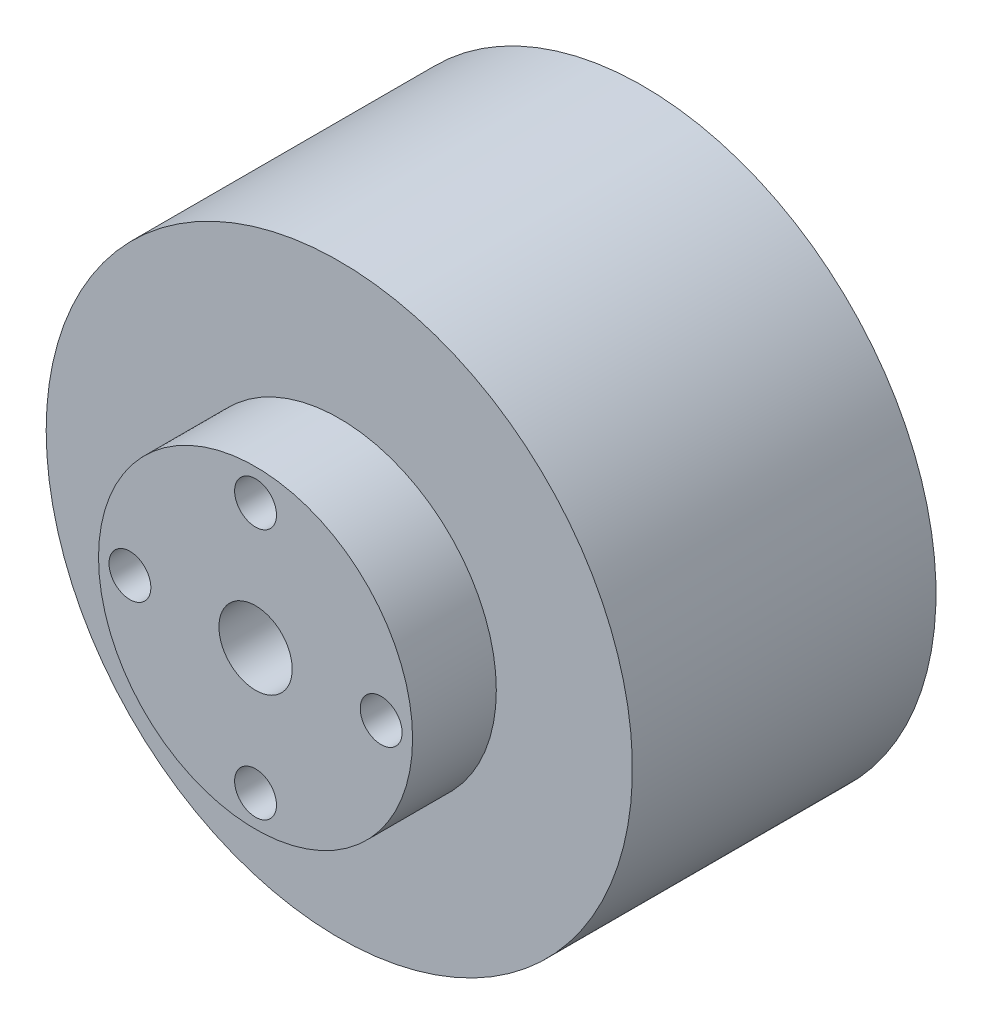
ISO-10303-21;
HEADER;
FILE_DESCRIPTION(('STEP AP214'),'2;1');
FILE_NAME('part.step','',(''),(''),'','','');
FILE_SCHEMA(('AUTOMOTIVE_DESIGN { 1 0 10303 214 1 1 1 1 }'));
ENDSEC;
DATA;
#1=APPLICATION_CONTEXT('core data for automotive mechanical design processes');
#2=APPLICATION_PROTOCOL_DEFINITION('international standard','automotive_design',2000,#1);
#3=PRODUCT_CONTEXT('',#1,'mechanical');
#4=PRODUCT('Part','Part','',(#3));
#5=PRODUCT_RELATED_PRODUCT_CATEGORY('part','',(#4));
#6=PRODUCT_DEFINITION_FORMATION('','',#4);
#7=PRODUCT_DEFINITION_CONTEXT('part definition',#1,'design');
#8=PRODUCT_DEFINITION('design','',#6,#7);
#9=PRODUCT_DEFINITION_SHAPE('','',#8);
#10=(LENGTH_UNIT() NAMED_UNIT(*) SI_UNIT(.MILLI.,.METRE.));
#11=(NAMED_UNIT(*) PLANE_ANGLE_UNIT() SI_UNIT($,.RADIAN.));
#12=(NAMED_UNIT(*) SI_UNIT($,.STERADIAN.) SOLID_ANGLE_UNIT());
#13=UNCERTAINTY_MEASURE_WITH_UNIT(LENGTH_MEASURE(1.E-05),#10,'distance_accuracy_value','');
#14=(GEOMETRIC_REPRESENTATION_CONTEXT(3) GLOBAL_UNCERTAINTY_ASSIGNED_CONTEXT((#13)) GLOBAL_UNIT_ASSIGNED_CONTEXT((#10,
#11,#12)) REPRESENTATION_CONTEXT('',''));
#15=CARTESIAN_POINT('',(0.,0.,0.));
#16=DIRECTION('',(0.,0.,1.));
#17=DIRECTION('',(1.,0.,0.));
#18=AXIS2_PLACEMENT_3D('',#15,#16,#17);
#19=CARTESIAN_POINT('',(0.,0.,14.5));
#20=DIRECTION('',(0.,0.,-1.));
#21=DIRECTION('',(-1.,0.,0.));
#22=AXIS2_PLACEMENT_3D('',#19,#20,#21);
#23=CYLINDRICAL_SURFACE('',#22,14.);
#24=CARTESIAN_POINT('',(0.,0.,14.5));
#25=DIRECTION('',(0.,0.,1.));
#26=DIRECTION('',(1.,0.,0.));
#27=AXIS2_PLACEMENT_3D('',#24,#25,#26);
#28=CIRCLE('',#27,14.);
#29=CARTESIAN_POINT('',(-14.,0.,14.5));
#30=VERTEX_POINT('',#29);
#31=EDGE_CURVE('E47',#30,#30,#28,.T.);
#32=CARTESIAN_POINT('',(0.,0.,0.));
#33=DIRECTION('',(0.,0.,1.));
#34=DIRECTION('',(1.,0.,0.));
#35=AXIS2_PLACEMENT_3D('',#32,#33,#34);
#36=CIRCLE('',#35,14.);
#37=CARTESIAN_POINT('',(-14.,0.,0.));
#38=VERTEX_POINT('',#37);
#39=EDGE_CURVE('E42',#38,#38,#36,.T.);
#40=CARTESIAN_POINT('',(-14.,0.,14.5));
#41=CARTESIAN_POINT('',(-14.,0.,14.3489583333333));
#42=CARTESIAN_POINT('',(-14.,0.,14.1979166666667));
#43=CARTESIAN_POINT('',(-14.,0.,13.8958333333333));
#44=CARTESIAN_POINT('',(-14.,0.,13.7447916666667));
#45=CARTESIAN_POINT('',(-14.,0.,13.4427083333333));
#46=CARTESIAN_POINT('',(-14.,0.,13.2916666666667));
#47=CARTESIAN_POINT('',(-14.,0.,12.9895833333333));
#48=CARTESIAN_POINT('',(-14.,0.,12.8385416666667));
#49=CARTESIAN_POINT('',(-14.,0.,12.5364583333333));
#50=CARTESIAN_POINT('',(-14.,0.,12.3854166666667));
#51=CARTESIAN_POINT('',(-14.,0.,12.0833333333333));
#52=CARTESIAN_POINT('',(-14.,0.,11.9322916666667));
#53=CARTESIAN_POINT('',(-14.,0.,11.6302083333333));
#54=CARTESIAN_POINT('',(-14.,0.,11.4791666666667));
#55=CARTESIAN_POINT('',(-14.,0.,11.1770833333333));
#56=CARTESIAN_POINT('',(-14.,0.,11.0260416666667));
#57=CARTESIAN_POINT('',(-14.,0.,10.7239583333333));
#58=CARTESIAN_POINT('',(-14.,0.,10.5729166666667));
#59=CARTESIAN_POINT('',(-14.,0.,10.2708333333333));
#60=CARTESIAN_POINT('',(-14.,0.,10.1197916666667));
#61=CARTESIAN_POINT('',(-14.,0.,9.81770833333333));
#62=CARTESIAN_POINT('',(-14.,0.,9.66666666666667));
#63=CARTESIAN_POINT('',(-14.,0.,9.36458333333333));
#64=CARTESIAN_POINT('',(-14.,0.,9.21354166666667));
#65=CARTESIAN_POINT('',(-14.,0.,8.91145833333333));
#66=CARTESIAN_POINT('',(-14.,0.,8.76041666666667));
#67=CARTESIAN_POINT('',(-14.,0.,8.45833333333333));
#68=CARTESIAN_POINT('',(-14.,0.,8.30729166666667));
#69=CARTESIAN_POINT('',(-14.,0.,8.00520833333333));
#70=CARTESIAN_POINT('',(-14.,0.,7.85416666666667));
#71=CARTESIAN_POINT('',(-14.,0.,7.55208333333333));
#72=CARTESIAN_POINT('',(-14.,0.,7.40104166666667));
#73=CARTESIAN_POINT('',(-14.,0.,7.09895833333333));
#74=CARTESIAN_POINT('',(-14.,0.,6.94791666666667));
#75=CARTESIAN_POINT('',(-14.,0.,6.64583333333333));
#76=CARTESIAN_POINT('',(-14.,0.,6.49479166666667));
#77=CARTESIAN_POINT('',(-14.,0.,6.19270833333333));
#78=CARTESIAN_POINT('',(-14.,0.,6.04166666666667));
#79=CARTESIAN_POINT('',(-14.,0.,5.73958333333333));
#80=CARTESIAN_POINT('',(-14.,0.,5.58854166666667));
#81=CARTESIAN_POINT('',(-14.,0.,5.28645833333333));
#82=CARTESIAN_POINT('',(-14.,0.,5.13541666666667));
#83=CARTESIAN_POINT('',(-14.,0.,4.83333333333333));
#84=CARTESIAN_POINT('',(-14.,0.,4.68229166666667));
#85=CARTESIAN_POINT('',(-14.,0.,4.38020833333333));
#86=CARTESIAN_POINT('',(-14.,0.,4.22916666666667));
#87=CARTESIAN_POINT('',(-14.,0.,3.92708333333333));
#88=CARTESIAN_POINT('',(-14.,0.,3.77604166666667));
#89=CARTESIAN_POINT('',(-14.,0.,3.47395833333333));
#90=CARTESIAN_POINT('',(-14.,0.,3.32291666666667));
#91=CARTESIAN_POINT('',(-14.,0.,3.02083333333333));
#92=CARTESIAN_POINT('',(-14.,0.,2.86979166666667));
#93=CARTESIAN_POINT('',(-14.,0.,2.56770833333333));
#94=CARTESIAN_POINT('',(-14.,0.,2.41666666666667));
#95=CARTESIAN_POINT('',(-14.,0.,2.11458333333333));
#96=CARTESIAN_POINT('',(-14.,0.,1.96354166666667));
#97=CARTESIAN_POINT('',(-14.,0.,1.66145833333333));
#98=CARTESIAN_POINT('',(-14.,0.,1.51041666666667));
#99=CARTESIAN_POINT('',(-14.,0.,1.20833333333333));
#100=CARTESIAN_POINT('',(-14.,0.,1.05729166666667));
#101=CARTESIAN_POINT('',(-14.,0.,0.755208333333334));
#102=CARTESIAN_POINT('',(-14.,0.,0.604166666666667));
#103=CARTESIAN_POINT('',(-14.,0.,0.302083333333333));
#104=CARTESIAN_POINT('',(-14.,0.,0.151041666666667));
#105=CARTESIAN_POINT('',(-14.,0.,0.));
#106=B_SPLINE_CURVE_WITH_KNOTS('',3,(#40,#41,#42,#43,#44,#45,#46,#47,#48,#49,#50,#51,#52,#53,
#54,#55,#56,#57,#58,#59,#60,#61,#62,#63,#64,#65,#66,#67,#68,#69,#70,#71,#72,#73,#74,#75,#76,#77,
#78,#79,#80,#81,#82,#83,#84,#85,#86,#87,#88,#89,#90,#91,#92,#93,#94,#95,#96,#97,#98,#99,#100,
#101,#102,#103,#104,#105),.UNSPECIFIED.,.F.,.F.,(4,2,2,2,2,2,2,2,2,2,2,2,2,2,2,2,2,2,2,2,2,2,2,
2,2,2,2,2,2,2,2,2,4),(0.,0.453125,0.906250000000001,1.359375,1.8125,2.265625,2.71875,3.171875,
3.625,4.078125,4.53125,4.984375,5.4375,5.890625,6.34375,6.796875,7.25,7.703125,8.15625,8.609375,
9.0625,9.515625,9.96875,10.421875,10.875,11.328125,11.78125,12.234375,12.6875,13.140625,
13.59375,14.046875,14.5),.UNSPECIFIED.);
#107=EDGE_CURVE('BSEAM39',#30,#38,#106,.T.);
#108=ORIENTED_EDGE('',*,*,#31,.F.);
#109=ORIENTED_EDGE('',*,*,#39,.T.);
#110=ORIENTED_EDGE('',*,*,#107,.T.);
#111=ORIENTED_EDGE('',*,*,#107,.F.);
#112=EDGE_LOOP('',(#108,#110,#109,#111));
#113=FACE_BOUND('',#112,.T.);
#114=ADVANCED_FACE('F39',(#113),#23,.T.);
#115=CARTESIAN_POINT('',(0.,0.,14.5));
#116=DIRECTION('',(0.,0.,1.));
#117=DIRECTION('',(1.,0.,0.));
#118=AXIS2_PLACEMENT_3D('',#115,#116,#117);
#119=PLANE('',#118);
#120=CARTESIAN_POINT('',(0.,0.,14.5));
#121=DIRECTION('',(0.,0.,1.));
#122=DIRECTION('',(1.,0.,0.));
#123=AXIS2_PLACEMENT_3D('',#120,#121,#122);
#124=CIRCLE('',#123,7.5);
#125=CARTESIAN_POINT('',(7.5,0.,14.5));
#126=VERTEX_POINT('',#125);
#127=EDGE_CURVE('E10',#126,#126,#124,.T.);
#128=ORIENTED_EDGE('',*,*,#127,.F.);
#129=EDGE_LOOP('',(#128));
#130=FACE_BOUND('',#129,.T.);
#131=ORIENTED_EDGE('',*,*,#31,.T.);
#132=EDGE_LOOP('',(#131));
#133=FACE_BOUND('',#132,.T.);
#134=ADVANCED_FACE('F143',(#130,#133),#119,.T.);
#135=CARTESIAN_POINT('',(0.,0.,0.));
#136=DIRECTION('',(0.,0.,1.));
#137=DIRECTION('',(1.,0.,0.));
#138=AXIS2_PLACEMENT_3D('',#135,#136,#137);
#139=PLANE('',#138);
#140=CARTESIAN_POINT('',(0.,8.,0.));
#141=DIRECTION('',(0.,0.,1.));
#142=DIRECTION('',(1.,0.,0.));
#143=AXIS2_PLACEMENT_3D('',#140,#141,#142);
#144=CIRCLE('',#143,1.5);
#145=CARTESIAN_POINT('',(1.5,8.,0.));
#146=VERTEX_POINT('',#145);
#147=EDGE_CURVE('E123',#146,#146,#144,.T.);
#148=ORIENTED_EDGE('',*,*,#147,.T.);
#149=EDGE_LOOP('',(#148));
#150=FACE_BOUND('',#149,.T.);
#151=CARTESIAN_POINT('',(-8.,0.,0.));
#152=DIRECTION('',(0.,0.,1.));
#153=DIRECTION('',(1.,0.,0.));
#154=AXIS2_PLACEMENT_3D('',#151,#152,#153);
#155=CIRCLE('',#154,1.5);
#156=CARTESIAN_POINT('',(-6.5,0.,0.));
#157=VERTEX_POINT('',#156);
#158=EDGE_CURVE('E115',#157,#157,#155,.T.);
#159=ORIENTED_EDGE('',*,*,#158,.T.);
#160=EDGE_LOOP('',(#159));
#161=FACE_BOUND('',#160,.T.);
#162=CARTESIAN_POINT('',(0.,-8.,0.));
#163=DIRECTION('',(0.,0.,1.));
#164=DIRECTION('',(1.,0.,0.));
#165=AXIS2_PLACEMENT_3D('',#162,#163,#164);
#166=CIRCLE('',#165,1.5);
#167=CARTESIAN_POINT('',(1.5,-8.,0.));
#168=VERTEX_POINT('',#167);
#169=EDGE_CURVE('E107',#168,#168,#166,.T.);
#170=ORIENTED_EDGE('',*,*,#169,.T.);
#171=EDGE_LOOP('',(#170));
#172=FACE_BOUND('',#171,.T.);
#173=CARTESIAN_POINT('',(8.,0.,0.));
#174=DIRECTION('',(0.,0.,1.));
#175=DIRECTION('',(1.,0.,0.));
#176=AXIS2_PLACEMENT_3D('',#173,#174,#175);
#177=CIRCLE('',#176,1.5);
#178=CARTESIAN_POINT('',(9.5,0.,0.));
#179=VERTEX_POINT('',#178);
#180=EDGE_CURVE('E99',#179,#179,#177,.T.);
#181=ORIENTED_EDGE('',*,*,#180,.T.);
#182=EDGE_LOOP('',(#181));
#183=FACE_BOUND('',#182,.T.);
#184=CARTESIAN_POINT('',(0.,0.,0.));
#185=DIRECTION('',(0.,0.,1.));
#186=DIRECTION('',(1.,0.,0.));
#187=AXIS2_PLACEMENT_3D('',#184,#185,#186);
#188=CIRCLE('',#187,1.75);
#189=CARTESIAN_POINT('',(1.75,0.,0.));
#190=VERTEX_POINT('',#189);
#191=EDGE_CURVE('E58',#190,#190,#188,.T.);
#192=ORIENTED_EDGE('',*,*,#191,.T.);
#193=EDGE_LOOP('',(#192));
#194=FACE_BOUND('',#193,.T.);
#195=ORIENTED_EDGE('',*,*,#39,.F.);
#196=EDGE_LOOP('',(#195));
#197=FACE_BOUND('',#196,.T.);
#198=ADVANCED_FACE('F148',(#150,#161,#172,#183,#194,#197),#139,.F.);
#199=CARTESIAN_POINT('',(0.,0.,18.5));
#200=DIRECTION('',(0.,0.,-1.));
#201=DIRECTION('',(-1.,0.,0.));
#202=AXIS2_PLACEMENT_3D('',#199,#200,#201);
#203=CYLINDRICAL_SURFACE('',#202,7.5);
#204=CARTESIAN_POINT('',(0.,0.,18.5));
#205=DIRECTION('',(0.,0.,1.));
#206=DIRECTION('',(1.,0.,0.));
#207=AXIS2_PLACEMENT_3D('',#204,#205,#206);
#208=CIRCLE('',#207,7.5);
#209=CARTESIAN_POINT('',(7.5,0.,18.5));
#210=VERTEX_POINT('',#209);
#211=EDGE_CURVE('E54',#210,#210,#208,.T.);
#212=ORIENTED_EDGE('',*,*,#211,.F.);
#213=EDGE_LOOP('',(#212));
#214=FACE_BOUND('',#213,.T.);
#215=ORIENTED_EDGE('',*,*,#127,.T.);
#216=EDGE_LOOP('',(#215));
#217=FACE_BOUND('',#216,.T.);
#218=ADVANCED_FACE('F158',(#214,#217),#203,.T.);
#219=CARTESIAN_POINT('',(0.,0.,18.5));
#220=DIRECTION('',(0.,0.,1.));
#221=DIRECTION('',(1.,0.,0.));
#222=AXIS2_PLACEMENT_3D('',#219,#220,#221);
#223=PLANE('',#222);
#224=CARTESIAN_POINT('',(6.,0.,18.5));
#225=DIRECTION('',(0.,0.,1.));
#226=DIRECTION('',(1.,0.,0.));
#227=AXIS2_PLACEMENT_3D('',#224,#225,#226);
#228=CIRCLE('',#227,1.);
#229=CARTESIAN_POINT('',(7.,0.,18.5));
#230=VERTEX_POINT('',#229);
#231=EDGE_CURVE('E92',#230,#230,#228,.T.);
#232=ORIENTED_EDGE('',*,*,#231,.F.);
#233=EDGE_LOOP('',(#232));
#234=FACE_BOUND('',#233,.T.);
#235=CARTESIAN_POINT('',(-6.,0.,18.5));
#236=DIRECTION('',(0.,0.,1.));
#237=DIRECTION('',(1.,0.,0.));
#238=AXIS2_PLACEMENT_3D('',#235,#236,#237);
#239=CIRCLE('',#238,1.);
#240=CARTESIAN_POINT('',(-5.,0.,18.5));
#241=VERTEX_POINT('',#240);
#242=EDGE_CURVE('E88',#241,#241,#239,.T.);
#243=ORIENTED_EDGE('',*,*,#242,.F.);
#244=EDGE_LOOP('',(#243));
#245=FACE_BOUND('',#244,.T.);
#246=CARTESIAN_POINT('',(0.,-6.,18.5));
#247=DIRECTION('',(0.,0.,1.));
#248=DIRECTION('',(1.,0.,0.));
#249=AXIS2_PLACEMENT_3D('',#246,#247,#248);
#250=CIRCLE('',#249,1.);
#251=CARTESIAN_POINT('',(1.00000000000001,-6.,18.5));
#252=VERTEX_POINT('',#251);
#253=EDGE_CURVE('E80',#252,#252,#250,.T.);
#254=ORIENTED_EDGE('',*,*,#253,.F.);
#255=EDGE_LOOP('',(#254));
#256=FACE_BOUND('',#255,.T.);
#257=CARTESIAN_POINT('',(0.,6.,18.5));
#258=DIRECTION('',(0.,0.,1.));
#259=DIRECTION('',(1.,0.,0.));
#260=AXIS2_PLACEMENT_3D('',#257,#258,#259);
#261=CIRCLE('',#260,1.);
#262=CARTESIAN_POINT('',(1.,6.,18.5));
#263=VERTEX_POINT('',#262);
#264=EDGE_CURVE('E71',#263,#263,#261,.T.);
#265=ORIENTED_EDGE('',*,*,#264,.F.);
#266=EDGE_LOOP('',(#265));
#267=FACE_BOUND('',#266,.T.);
#268=CARTESIAN_POINT('',(0.,0.,18.5));
#269=DIRECTION('',(0.,0.,1.));
#270=DIRECTION('',(1.,0.,0.));
#271=AXIS2_PLACEMENT_3D('',#268,#269,#270);
#272=CIRCLE('',#271,1.75);
#273=CARTESIAN_POINT('',(1.75,0.,18.5));
#274=VERTEX_POINT('',#273);
#275=EDGE_CURVE('E59',#274,#274,#272,.T.);
#276=ORIENTED_EDGE('',*,*,#275,.F.);
#277=EDGE_LOOP('',(#276));
#278=FACE_BOUND('',#277,.T.);
#279=ORIENTED_EDGE('',*,*,#211,.T.);
#280=EDGE_LOOP('',(#279));
#281=FACE_BOUND('',#280,.T.);
#282=ADVANCED_FACE('F163',(#234,#245,#256,#267,#278,#281),#223,.T.);
#283=CARTESIAN_POINT('',(0.,0.,0.));
#284=DIRECTION('',(0.,0.,1.));
#285=DIRECTION('',(1.,0.,0.));
#286=AXIS2_PLACEMENT_3D('',#283,#284,#285);
#287=CYLINDRICAL_SURFACE('',#286,1.75);
#288=ORIENTED_EDGE('',*,*,#191,.F.);
#289=EDGE_LOOP('',(#288));
#290=FACE_BOUND('',#289,.T.);
#291=ORIENTED_EDGE('',*,*,#275,.T.);
#292=EDGE_LOOP('',(#291));
#293=FACE_BOUND('',#292,.T.);
#294=ADVANCED_FACE('F170',(#290,#293),#287,.F.);
#295=CARTESIAN_POINT('',(0.,6.,15.5));
#296=DIRECTION('',(0.,0.,1.));
#297=DIRECTION('',(1.,0.,0.));
#298=AXIS2_PLACEMENT_3D('',#295,#296,#297);
#299=CYLINDRICAL_SURFACE('',#298,1.);
#300=CARTESIAN_POINT('',(0.,6.,15.5));
#301=DIRECTION('',(0.,0.,1.));
#302=DIRECTION('',(1.,0.,0.));
#303=AXIS2_PLACEMENT_3D('',#300,#301,#302);
#304=CIRCLE('',#303,1.);
#305=CARTESIAN_POINT('',(1.,6.,15.5));
#306=VERTEX_POINT('',#305);
#307=EDGE_CURVE('E67',#306,#306,#304,.T.);
#308=ORIENTED_EDGE('',*,*,#307,.F.);
#309=EDGE_LOOP('',(#308));
#310=FACE_BOUND('',#309,.T.);
#311=ORIENTED_EDGE('',*,*,#264,.T.);
#312=EDGE_LOOP('',(#311));
#313=FACE_BOUND('',#312,.T.);
#314=ADVANCED_FACE('F174',(#310,#313),#299,.F.);
#315=CARTESIAN_POINT('',(0.,6.,15.5));
#316=DIRECTION('',(0.,0.,1.));
#317=DIRECTION('',(1.,0.,0.));
#318=AXIS2_PLACEMENT_3D('',#315,#316,#317);
#319=PLANE('',#318);
#320=ORIENTED_EDGE('',*,*,#307,.T.);
#321=EDGE_LOOP('',(#320));
#322=FACE_BOUND('',#321,.T.);
#323=ADVANCED_FACE('F176',(#322),#319,.T.);
#324=CARTESIAN_POINT('',(0.,-6.,15.5));
#325=DIRECTION('',(0.,0.,1.));
#326=DIRECTION('',(1.,0.,0.));
#327=AXIS2_PLACEMENT_3D('',#324,#325,#326);
#328=CYLINDRICAL_SURFACE('',#327,1.);
#329=CARTESIAN_POINT('',(0.,-6.,15.5));
#330=DIRECTION('',(0.,0.,1.));
#331=DIRECTION('',(1.,0.,0.));
#332=AXIS2_PLACEMENT_3D('',#329,#330,#331);
#333=CIRCLE('',#332,1.);
#334=CARTESIAN_POINT('',(1.00000000000001,-6.,15.5));
#335=VERTEX_POINT('',#334);
#336=EDGE_CURVE('E76',#335,#335,#333,.T.);
#337=ORIENTED_EDGE('',*,*,#336,.F.);
#338=EDGE_LOOP('',(#337));
#339=FACE_BOUND('',#338,.T.);
#340=ORIENTED_EDGE('',*,*,#253,.T.);
#341=EDGE_LOOP('',(#340));
#342=FACE_BOUND('',#341,.T.);
#343=ADVANCED_FACE('F179',(#339,#342),#328,.F.);
#344=CARTESIAN_POINT('',(0.,-6.,15.5));
#345=DIRECTION('',(0.,0.,1.));
#346=DIRECTION('',(1.,0.,0.));
#347=AXIS2_PLACEMENT_3D('',#344,#345,#346);
#348=PLANE('',#347);
#349=ORIENTED_EDGE('',*,*,#336,.T.);
#350=EDGE_LOOP('',(#349));
#351=FACE_BOUND('',#350,.T.);
#352=ADVANCED_FACE('F184',(#351),#348,.T.);
#353=CARTESIAN_POINT('',(-6.,0.,15.5));
#354=DIRECTION('',(0.,0.,1.));
#355=DIRECTION('',(1.,0.,0.));
#356=AXIS2_PLACEMENT_3D('',#353,#354,#355);
#357=CYLINDRICAL_SURFACE('',#356,1.);
#358=CARTESIAN_POINT('',(-6.,0.,15.5));
#359=DIRECTION('',(0.,0.,1.));
#360=DIRECTION('',(1.,0.,0.));
#361=AXIS2_PLACEMENT_3D('',#358,#359,#360);
#362=CIRCLE('',#361,1.);
#363=CARTESIAN_POINT('',(-5.,0.,15.5));
#364=VERTEX_POINT('',#363);
#365=EDGE_CURVE('E84',#364,#364,#362,.T.);
#366=ORIENTED_EDGE('',*,*,#365,.F.);
#367=EDGE_LOOP('',(#366));
#368=FACE_BOUND('',#367,.T.);
#369=ORIENTED_EDGE('',*,*,#242,.T.);
#370=EDGE_LOOP('',(#369));
#371=FACE_BOUND('',#370,.T.);
#372=ADVANCED_FACE('F187',(#368,#371),#357,.F.);
#373=CARTESIAN_POINT('',(-6.,0.,15.5));
#374=DIRECTION('',(0.,0.,1.));
#375=DIRECTION('',(1.,0.,0.));
#376=AXIS2_PLACEMENT_3D('',#373,#374,#375);
#377=PLANE('',#376);
#378=ORIENTED_EDGE('',*,*,#365,.T.);
#379=EDGE_LOOP('',(#378));
#380=FACE_BOUND('',#379,.T.);
#381=ADVANCED_FACE('F192',(#380),#377,.T.);
#382=CARTESIAN_POINT('',(6.,0.,15.5));
#383=DIRECTION('',(0.,0.,1.));
#384=DIRECTION('',(1.,0.,0.));
#385=AXIS2_PLACEMENT_3D('',#382,#383,#384);
#386=CYLINDRICAL_SURFACE('',#385,1.);
#387=CARTESIAN_POINT('',(6.,0.,15.5));
#388=DIRECTION('',(0.,0.,1.));
#389=DIRECTION('',(1.,0.,0.));
#390=AXIS2_PLACEMENT_3D('',#387,#388,#389);
#391=CIRCLE('',#390,1.);
#392=CARTESIAN_POINT('',(7.,0.,15.5));
#393=VERTEX_POINT('',#392);
#394=EDGE_CURVE('E63',#393,#393,#391,.T.);
#395=ORIENTED_EDGE('',*,*,#394,.F.);
#396=EDGE_LOOP('',(#395));
#397=FACE_BOUND('',#396,.T.);
#398=ORIENTED_EDGE('',*,*,#231,.T.);
#399=EDGE_LOOP('',(#398));
#400=FACE_BOUND('',#399,.T.);
#401=ADVANCED_FACE('F195',(#397,#400),#386,.F.);
#402=CARTESIAN_POINT('',(6.,0.,15.5));
#403=DIRECTION('',(0.,0.,1.));
#404=DIRECTION('',(1.,0.,0.));
#405=AXIS2_PLACEMENT_3D('',#402,#403,#404);
#406=PLANE('',#405);
#407=ORIENTED_EDGE('',*,*,#394,.T.);
#408=EDGE_LOOP('',(#407));
#409=FACE_BOUND('',#408,.T.);
#410=ADVANCED_FACE('F202',(#409),#406,.T.);
#411=CARTESIAN_POINT('',(8.,0.,3.));
#412=DIRECTION('',(0.,0.,-1.));
#413=DIRECTION('',(-1.,0.,0.));
#414=AXIS2_PLACEMENT_3D('',#411,#412,#413);
#415=CYLINDRICAL_SURFACE('',#414,1.5);
#416=CARTESIAN_POINT('',(8.,0.,3.));
#417=DIRECTION('',(0.,0.,1.));
#418=DIRECTION('',(1.,0.,0.));
#419=AXIS2_PLACEMENT_3D('',#416,#417,#418);
#420=CIRCLE('',#419,1.5);
#421=CARTESIAN_POINT('',(9.5,0.,3.));
#422=VERTEX_POINT('',#421);
#423=EDGE_CURVE('E103',#422,#422,#420,.T.);
#424=ORIENTED_EDGE('',*,*,#423,.T.);
#425=EDGE_LOOP('',(#424));
#426=FACE_BOUND('',#425,.T.);
#427=ORIENTED_EDGE('',*,*,#180,.F.);
#428=EDGE_LOOP('',(#427));
#429=FACE_BOUND('',#428,.T.);
#430=ADVANCED_FACE('F206',(#426,#429),#415,.F.);
#431=CARTESIAN_POINT('',(8.,0.,3.));
#432=DIRECTION('',(0.,0.,1.));
#433=DIRECTION('',(1.,0.,0.));
#434=AXIS2_PLACEMENT_3D('',#431,#432,#433);
#435=PLANE('',#434);
#436=ORIENTED_EDGE('',*,*,#423,.F.);
#437=EDGE_LOOP('',(#436));
#438=FACE_BOUND('',#437,.T.);
#439=ADVANCED_FACE('F210',(#438),#435,.F.);
#440=CARTESIAN_POINT('',(0.,-8.,3.));
#441=DIRECTION('',(0.,0.,-1.));
#442=DIRECTION('',(-1.,0.,0.));
#443=AXIS2_PLACEMENT_3D('',#440,#441,#442);
#444=CYLINDRICAL_SURFACE('',#443,1.5);
#445=CARTESIAN_POINT('',(0.,-8.,3.));
#446=DIRECTION('',(0.,0.,1.));
#447=DIRECTION('',(1.,0.,0.));
#448=AXIS2_PLACEMENT_3D('',#445,#446,#447);
#449=CIRCLE('',#448,1.5);
#450=CARTESIAN_POINT('',(1.5,-8.,3.));
#451=VERTEX_POINT('',#450);
#452=EDGE_CURVE('E111',#451,#451,#449,.T.);
#453=ORIENTED_EDGE('',*,*,#452,.T.);
#454=EDGE_LOOP('',(#453));
#455=FACE_BOUND('',#454,.T.);
#456=ORIENTED_EDGE('',*,*,#169,.F.);
#457=EDGE_LOOP('',(#456));
#458=FACE_BOUND('',#457,.T.);
#459=ADVANCED_FACE('F214',(#455,#458),#444,.F.);
#460=CARTESIAN_POINT('',(0.,-8.,3.));
#461=DIRECTION('',(0.,0.,1.));
#462=DIRECTION('',(1.,0.,0.));
#463=AXIS2_PLACEMENT_3D('',#460,#461,#462);
#464=PLANE('',#463);
#465=ORIENTED_EDGE('',*,*,#452,.F.);
#466=EDGE_LOOP('',(#465));
#467=FACE_BOUND('',#466,.T.);
#468=ADVANCED_FACE('F218',(#467),#464,.F.);
#469=CARTESIAN_POINT('',(-8.,0.,3.));
#470=DIRECTION('',(0.,0.,-1.));
#471=DIRECTION('',(-1.,0.,0.));
#472=AXIS2_PLACEMENT_3D('',#469,#470,#471);
#473=CYLINDRICAL_SURFACE('',#472,1.5);
#474=CARTESIAN_POINT('',(-8.,0.,3.));
#475=DIRECTION('',(0.,0.,1.));
#476=DIRECTION('',(1.,0.,0.));
#477=AXIS2_PLACEMENT_3D('',#474,#475,#476);
#478=CIRCLE('',#477,1.5);
#479=CARTESIAN_POINT('',(-6.5,0.,3.));
#480=VERTEX_POINT('',#479);
#481=EDGE_CURVE('E119',#480,#480,#478,.T.);
#482=ORIENTED_EDGE('',*,*,#481,.T.);
#483=EDGE_LOOP('',(#482));
#484=FACE_BOUND('',#483,.T.);
#485=ORIENTED_EDGE('',*,*,#158,.F.);
#486=EDGE_LOOP('',(#485));
#487=FACE_BOUND('',#486,.T.);
#488=ADVANCED_FACE('F222',(#484,#487),#473,.F.);
#489=CARTESIAN_POINT('',(-8.,0.,3.));
#490=DIRECTION('',(0.,0.,1.));
#491=DIRECTION('',(1.,0.,0.));
#492=AXIS2_PLACEMENT_3D('',#489,#490,#491);
#493=PLANE('',#492);
#494=ORIENTED_EDGE('',*,*,#481,.F.);
#495=EDGE_LOOP('',(#494));
#496=FACE_BOUND('',#495,.T.);
#497=ADVANCED_FACE('F140',(#496),#493,.F.);
#498=CARTESIAN_POINT('',(0.,8.,3.));
#499=DIRECTION('',(0.,0.,-1.));
#500=DIRECTION('',(-1.,0.,0.));
#501=AXIS2_PLACEMENT_3D('',#498,#499,#500);
#502=CYLINDRICAL_SURFACE('',#501,1.5);
#503=CARTESIAN_POINT('',(0.,8.,3.));
#504=DIRECTION('',(0.,0.,1.));
#505=DIRECTION('',(1.,0.,0.));
#506=AXIS2_PLACEMENT_3D('',#503,#504,#505);
#507=CIRCLE('',#506,1.5);
#508=CARTESIAN_POINT('',(1.5,8.,3.));
#509=VERTEX_POINT('',#508);
#510=EDGE_CURVE('E72',#509,#509,#507,.T.);
#511=ORIENTED_EDGE('',*,*,#510,.T.);
#512=EDGE_LOOP('',(#511));
#513=FACE_BOUND('',#512,.T.);
#514=ORIENTED_EDGE('',*,*,#147,.F.);
#515=EDGE_LOOP('',(#514));
#516=FACE_BOUND('',#515,.T.);
#517=ADVANCED_FACE('F131',(#513,#516),#502,.F.);
#518=CARTESIAN_POINT('',(0.,8.,3.));
#519=DIRECTION('',(0.,0.,1.));
#520=DIRECTION('',(1.,0.,0.));
#521=AXIS2_PLACEMENT_3D('',#518,#519,#520);
#522=PLANE('',#521);
#523=ORIENTED_EDGE('',*,*,#510,.F.);
#524=EDGE_LOOP('',(#523));
#525=FACE_BOUND('',#524,.T.);
#526=ADVANCED_FACE('F134',(#525),#522,.F.);
#527=CLOSED_SHELL('',(#114,#134,#198,#218,#282,#294,#314,#323,#343,#352,#372,#381,#401,#410,
#430,#439,#459,#468,#488,#497,#517,#526));
#528=MANIFOLD_SOLID_BREP('B2',#527);
#529=ADVANCED_BREP_SHAPE_REPRESENTATION('',(#18,#528),#14);
#530=SHAPE_DEFINITION_REPRESENTATION(#9,#529);
ENDSEC;
END-ISO-10303-21;
